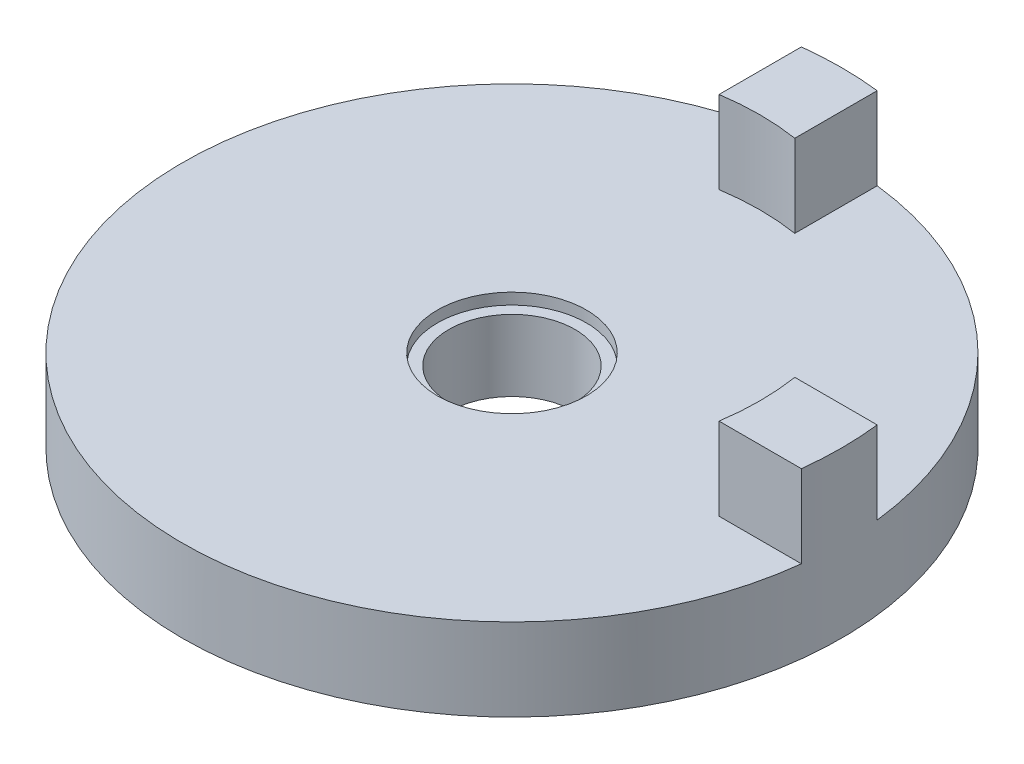
ISO-10303-21;
HEADER;
FILE_DESCRIPTION(('STEP AP214'),'2;1');
FILE_NAME('part.step','',(''),(''),'','','');
FILE_SCHEMA(('AUTOMOTIVE_DESIGN { 1 0 10303 214 1 1 1 1 }'));
ENDSEC;
DATA;
#1=APPLICATION_CONTEXT('core data for automotive mechanical design processes');
#2=APPLICATION_PROTOCOL_DEFINITION('international standard','automotive_design',2000,#1);
#3=PRODUCT_CONTEXT('',#1,'mechanical');
#4=PRODUCT('Part','Part','',(#3));
#5=PRODUCT_RELATED_PRODUCT_CATEGORY('part','',(#4));
#6=PRODUCT_DEFINITION_FORMATION('','',#4);
#7=PRODUCT_DEFINITION_CONTEXT('part definition',#1,'design');
#8=PRODUCT_DEFINITION('design','',#6,#7);
#9=PRODUCT_DEFINITION_SHAPE('','',#8);
#10=(LENGTH_UNIT() NAMED_UNIT(*) SI_UNIT(.MILLI.,.METRE.));
#11=(NAMED_UNIT(*) PLANE_ANGLE_UNIT() SI_UNIT($,.RADIAN.));
#12=(NAMED_UNIT(*) SI_UNIT($,.STERADIAN.) SOLID_ANGLE_UNIT());
#13=UNCERTAINTY_MEASURE_WITH_UNIT(LENGTH_MEASURE(1.E-05),#10,'distance_accuracy_value','');
#14=(GEOMETRIC_REPRESENTATION_CONTEXT(3) GLOBAL_UNCERTAINTY_ASSIGNED_CONTEXT((#13)) GLOBAL_UNIT_ASSIGNED_CONTEXT((#10,
#11,#12)) REPRESENTATION_CONTEXT('',''));
#15=CARTESIAN_POINT('',(0.,0.,0.));
#16=DIRECTION('',(0.,0.,1.));
#17=DIRECTION('',(1.,0.,0.));
#18=AXIS2_PLACEMENT_3D('',#15,#16,#17);
#19=CARTESIAN_POINT('',(0.,6.35,0.));
#20=DIRECTION('',(0.,1.,0.));
#21=DIRECTION('',(0.,0.,1.));
#22=AXIS2_PLACEMENT_3D('',#19,#20,#21);
#23=PLANE('',#22);
#24=CARTESIAN_POINT('',(0.,6.35,0.));
#25=DIRECTION('',(0.,1.,0.));
#26=DIRECTION('',(0.,0.,1.));
#27=AXIS2_PLACEMENT_3D('',#24,#25,#26);
#28=CIRCLE('',#27,5.7404);
#29=CARTESIAN_POINT('',(0.,6.35,5.7404));
#30=VERTEX_POINT('',#29);
#31=EDGE_CURVE('E241',#30,#30,#28,.T.);
#32=ORIENTED_EDGE('',*,*,#31,.F.);
#33=EDGE_LOOP('',(#32));
#34=FACE_BOUND('',#33,.T.);
#35=CARTESIAN_POINT('',(0.,6.35,0.));
#36=DIRECTION('',(0.,1.,0.));
#37=DIRECTION('',(0.,0.,1.));
#38=AXIS2_PLACEMENT_3D('',#35,#36,#37);
#39=CIRCLE('',#38,25.4);
#40=CARTESIAN_POINT('',(-2.921,6.35,-25.2314834878966));
#41=VERTEX_POINT('',#40);
#42=CARTESIAN_POINT('',(25.2314834878965,6.35,2.92100000000086));
#43=VERTEX_POINT('',#42);
#44=EDGE_CURVE('E11',#41,#43,#39,.T.);
#45=ORIENTED_EDGE('',*,*,#44,.T.);
#46=DIRECTION('',(1.,0.,0.));
#47=VECTOR('',#46,1.);
#48=CARTESIAN_POINT('',(0.,6.35,2.921));
#49=LINE('',#48,#47);
#50=CARTESIAN_POINT('',(18.8814834878965,6.35,2.92100000000064));
#51=VERTEX_POINT('',#50);
#52=EDGE_CURVE('E51',#51,#43,#49,.T.);
#53=ORIENTED_EDGE('',*,*,#52,.F.);
#54=CARTESIAN_POINT('',(0.,6.35,0.));
#55=DIRECTION('',(0.,1.,0.));
#56=DIRECTION('',(0.,0.,1.));
#57=AXIS2_PLACEMENT_3D('',#54,#55,#56);
#58=CIRCLE('',#57,19.1060895973957);
#59=CARTESIAN_POINT('',(18.8814834878967,6.35,-2.92099999999936));
#60=VERTEX_POINT('',#59);
#61=EDGE_CURVE('E56',#51,#60,#58,.T.);
#62=ORIENTED_EDGE('',*,*,#61,.T.);
#63=DIRECTION('',(1.,0.,0.));
#64=VECTOR('',#63,1.);
#65=CARTESIAN_POINT('',(0.,6.35,-2.921));
#66=LINE('',#65,#64);
#67=CARTESIAN_POINT('',(25.2314834878967,6.35,-2.92099999999914));
#68=VERTEX_POINT('',#67);
#69=EDGE_CURVE('E121',#60,#68,#66,.T.);
#70=ORIENTED_EDGE('',*,*,#69,.T.);
#71=CARTESIAN_POINT('',(2.921,6.35,-25.2314834878966));
#72=VERTEX_POINT('',#71);
#73=EDGE_CURVE('E39',#68,#72,#39,.T.);
#74=ORIENTED_EDGE('',*,*,#73,.T.);
#75=DIRECTION('',(0.,0.,-1.));
#76=VECTOR('',#75,1.);
#77=CARTESIAN_POINT('',(2.921,6.35,0.));
#78=LINE('',#77,#76);
#79=CARTESIAN_POINT('',(2.921,6.35,-18.8814834878966));
#80=VERTEX_POINT('',#79);
#81=EDGE_CURVE('E148',#80,#72,#78,.T.);
#82=ORIENTED_EDGE('',*,*,#81,.F.);
#83=CARTESIAN_POINT('',(0.,6.35,0.));
#84=DIRECTION('',(0.,1.,0.));
#85=DIRECTION('',(0.,0.,1.));
#86=AXIS2_PLACEMENT_3D('',#83,#84,#85);
#87=CIRCLE('',#86,19.1060895973957);
#88=CARTESIAN_POINT('',(-2.921,6.35,-18.8814834878966));
#89=VERTEX_POINT('',#88);
#90=EDGE_CURVE('E107',#80,#89,#87,.T.);
#91=ORIENTED_EDGE('',*,*,#90,.T.);
#92=DIRECTION('',(0.,0.,-1.));
#93=VECTOR('',#92,1.);
#94=CARTESIAN_POINT('',(-2.921,6.35,0.));
#95=LINE('',#94,#93);
#96=EDGE_CURVE('E139',#89,#41,#95,.T.);
#97=ORIENTED_EDGE('',*,*,#96,.T.);
#98=EDGE_LOOP('',(#45,#53,#62,#70,#74,#82,#91,#97));
#99=FACE_BOUND('',#98,.T.);
#100=ADVANCED_FACE('F35',(#34,#99),#23,.T.);
#101=CARTESIAN_POINT('',(0.,0.,0.));
#102=DIRECTION('',(0.,1.,0.));
#103=DIRECTION('',(0.,0.,1.));
#104=AXIS2_PLACEMENT_3D('',#101,#102,#103);
#105=CYLINDRICAL_SURFACE('',#104,4.8641);
#106=CARTESIAN_POINT('',(0.,0.,0.));
#107=DIRECTION('',(0.,1.,0.));
#108=DIRECTION('',(0.,0.,1.));
#109=AXIS2_PLACEMENT_3D('',#106,#107,#108);
#110=CIRCLE('',#109,4.8641);
#111=CARTESIAN_POINT('',(0.,0.,4.8641));
#112=VERTEX_POINT('',#111);
#113=EDGE_CURVE('E226',#112,#112,#110,.T.);
#114=ORIENTED_EDGE('',*,*,#113,.F.);
#115=EDGE_LOOP('',(#114));
#116=FACE_BOUND('',#115,.T.);
#117=CARTESIAN_POINT('',(0.,5.4864,0.));
#118=DIRECTION('',(0.,1.,0.));
#119=DIRECTION('',(0.,0.,1.));
#120=AXIS2_PLACEMENT_3D('',#117,#118,#119);
#121=CIRCLE('',#120,4.8641);
#122=CARTESIAN_POINT('',(0.,5.4864,4.8641));
#123=VERTEX_POINT('',#122);
#124=EDGE_CURVE('E230',#123,#123,#121,.F.);
#125=ORIENTED_EDGE('',*,*,#124,.F.);
#126=EDGE_LOOP('',(#125));
#127=FACE_BOUND('',#126,.T.);
#128=ADVANCED_FACE('F202',(#116,#127),#105,.F.);
#129=CARTESIAN_POINT('',(0.,6.35,0.));
#130=DIRECTION('',(0.,-1.,0.));
#131=DIRECTION('',(0.,0.,-1.));
#132=AXIS2_PLACEMENT_3D('',#129,#130,#131);
#133=CYLINDRICAL_SURFACE('',#132,25.4);
#134=ORIENTED_EDGE('',*,*,#44,.F.);
#135=DIRECTION('',(0.,-1.,0.));
#136=VECTOR('',#135,1.);
#137=CARTESIAN_POINT('',(-2.921,12.7,-25.2314834878966));
#138=LINE('',#137,#136);
#139=CARTESIAN_POINT('',(-2.921,12.7,-25.2314834878966));
#140=VERTEX_POINT('',#139);
#141=EDGE_CURVE('E159',#140,#41,#138,.T.);
#142=ORIENTED_EDGE('',*,*,#141,.F.);
#143=CARTESIAN_POINT('',(0.,12.7,0.));
#144=DIRECTION('',(0.,1.,0.));
#145=DIRECTION('',(0.,0.,1.));
#146=AXIS2_PLACEMENT_3D('',#143,#144,#145);
#147=CIRCLE('',#146,25.4);
#148=CARTESIAN_POINT('',(2.921,12.7,-25.2314834878966));
#149=VERTEX_POINT('',#148);
#150=EDGE_CURVE('E141',#149,#140,#147,.T.);
#151=ORIENTED_EDGE('',*,*,#150,.F.);
#152=DIRECTION('',(0.,-1.,0.));
#153=VECTOR('',#152,1.);
#154=CARTESIAN_POINT('',(2.921,12.7,-25.2314834878966));
#155=LINE('',#154,#153);
#156=EDGE_CURVE('E155',#149,#72,#155,.T.);
#157=ORIENTED_EDGE('',*,*,#156,.T.);
#158=ORIENTED_EDGE('',*,*,#73,.F.);
#159=DIRECTION('',(0.,-1.,0.));
#160=VECTOR('',#159,1.);
#161=CARTESIAN_POINT('',(25.2314834878967,12.7,-2.92099999999914));
#162=LINE('',#161,#160);
#163=CARTESIAN_POINT('',(25.2314834878967,12.7,-2.92099999999914));
#164=VERTEX_POINT('',#163);
#165=EDGE_CURVE('E131',#164,#68,#162,.T.);
#166=ORIENTED_EDGE('',*,*,#165,.F.);
#167=CARTESIAN_POINT('',(0.,12.7,0.));
#168=DIRECTION('',(0.,1.,0.));
#169=DIRECTION('',(0.,0.,1.));
#170=AXIS2_PLACEMENT_3D('',#167,#168,#169);
#171=CIRCLE('',#170,25.4);
#172=CARTESIAN_POINT('',(25.2314834878965,12.7,2.92100000000086));
#173=VERTEX_POINT('',#172);
#174=EDGE_CURVE('E116',#173,#164,#171,.T.);
#175=ORIENTED_EDGE('',*,*,#174,.F.);
#176=DIRECTION('',(0.,-1.,0.));
#177=VECTOR('',#176,1.);
#178=CARTESIAN_POINT('',(25.2314834878965,12.7,2.92100000000086));
#179=LINE('',#178,#177);
#180=EDGE_CURVE('E108',#173,#43,#179,.T.);
#181=ORIENTED_EDGE('',*,*,#180,.T.);
#182=EDGE_LOOP('',(#134,#142,#151,#157,#158,#166,#175,#181));
#183=FACE_BOUND('',#182,.T.);
#184=CARTESIAN_POINT('',(0.,0.,0.));
#185=DIRECTION('',(0.,1.,0.));
#186=DIRECTION('',(0.,0.,1.));
#187=AXIS2_PLACEMENT_3D('',#184,#185,#186);
#188=CIRCLE('',#187,25.4);
#189=CARTESIAN_POINT('',(0.,0.,25.4));
#190=VERTEX_POINT('',#189);
#191=EDGE_CURVE('E186',#190,#190,#188,.T.);
#192=ORIENTED_EDGE('',*,*,#191,.T.);
#193=EDGE_LOOP('',(#192));
#194=FACE_BOUND('',#193,.T.);
#195=ADVANCED_FACE('F37',(#183,#194),#133,.T.);
#196=CARTESIAN_POINT('',(0.,0.,0.));
#197=DIRECTION('',(0.,1.,0.));
#198=DIRECTION('',(0.,0.,1.));
#199=AXIS2_PLACEMENT_3D('',#196,#197,#198);
#200=PLANE('',#199);
#201=ORIENTED_EDGE('',*,*,#113,.T.);
#202=EDGE_LOOP('',(#201));
#203=FACE_BOUND('',#202,.T.);
#204=ORIENTED_EDGE('',*,*,#191,.F.);
#205=EDGE_LOOP('',(#204));
#206=FACE_BOUND('',#205,.T.);
#207=ADVANCED_FACE('F212',(#203,#206),#200,.F.);
#208=CARTESIAN_POINT('',(0.,5.4864,0.));
#209=DIRECTION('',(0.,1.,0.));
#210=DIRECTION('',(0.,0.,1.));
#211=AXIS2_PLACEMENT_3D('',#208,#209,#210);
#212=PLANE('',#211);
#213=CARTESIAN_POINT('',(0.,5.4864,0.));
#214=DIRECTION('',(0.,1.,0.));
#215=DIRECTION('',(0.,0.,1.));
#216=AXIS2_PLACEMENT_3D('',#213,#214,#215);
#217=CIRCLE('',#216,5.7404);
#218=CARTESIAN_POINT('',(0.,5.4864,5.7404));
#219=VERTEX_POINT('',#218);
#220=EDGE_CURVE('E235',#219,#219,#217,.T.);
#221=ORIENTED_EDGE('',*,*,#220,.T.);
#222=EDGE_LOOP('',(#221));
#223=FACE_BOUND('',#222,.T.);
#224=ORIENTED_EDGE('',*,*,#124,.T.);
#225=EDGE_LOOP('',(#224));
#226=FACE_BOUND('',#225,.T.);
#227=ADVANCED_FACE('F214',(#223,#226),#212,.T.);
#228=CARTESIAN_POINT('',(0.,5.4864,0.));
#229=DIRECTION('',(0.,1.,0.));
#230=DIRECTION('',(0.,0.,1.));
#231=AXIS2_PLACEMENT_3D('',#228,#229,#230);
#232=CYLINDRICAL_SURFACE('',#231,5.7404);
#233=ORIENTED_EDGE('',*,*,#220,.F.);
#234=EDGE_LOOP('',(#233));
#235=FACE_BOUND('',#234,.T.);
#236=ORIENTED_EDGE('',*,*,#31,.T.);
#237=EDGE_LOOP('',(#236));
#238=FACE_BOUND('',#237,.T.);
#239=ADVANCED_FACE('F220',(#235,#238),#232,.F.);
#240=CARTESIAN_POINT('',(0.,12.7,0.));
#241=DIRECTION('',(0.,-1.,0.));
#242=DIRECTION('',(0.,0.,-1.));
#243=AXIS2_PLACEMENT_3D('',#240,#241,#242);
#244=CYLINDRICAL_SURFACE('',#243,19.1060895973957);
#245=ORIENTED_EDGE('',*,*,#90,.F.);
#246=DIRECTION('',(0.,-1.,0.));
#247=VECTOR('',#246,1.);
#248=CARTESIAN_POINT('',(2.921,12.7,-18.8814834878966));
#249=LINE('',#248,#247);
#250=CARTESIAN_POINT('',(2.921,12.7,-18.8814834878966));
#251=VERTEX_POINT('',#250);
#252=EDGE_CURVE('E158',#251,#80,#249,.T.);
#253=ORIENTED_EDGE('',*,*,#252,.F.);
#254=CARTESIAN_POINT('',(0.,12.7,0.));
#255=DIRECTION('',(0.,1.,0.));
#256=DIRECTION('',(0.,0.,1.));
#257=AXIS2_PLACEMENT_3D('',#254,#255,#256);
#258=CIRCLE('',#257,19.1060895973957);
#259=CARTESIAN_POINT('',(-2.921,12.7,-18.8814834878966));
#260=VERTEX_POINT('',#259);
#261=EDGE_CURVE('E135',#251,#260,#258,.T.);
#262=ORIENTED_EDGE('',*,*,#261,.T.);
#263=DIRECTION('',(0.,-1.,0.));
#264=VECTOR('',#263,1.);
#265=CARTESIAN_POINT('',(-2.921,12.7,-18.8814834878966));
#266=LINE('',#265,#264);
#267=EDGE_CURVE('E146',#260,#89,#266,.T.);
#268=ORIENTED_EDGE('',*,*,#267,.T.);
#269=EDGE_LOOP('',(#245,#253,#262,#268));
#270=FACE_BOUND('',#269,.T.);
#271=ADVANCED_FACE('F173',(#270),#244,.F.);
#272=CARTESIAN_POINT('',(2.921,12.7,0.));
#273=DIRECTION('',(-1.,0.,0.));
#274=DIRECTION('',(0.,0.,1.));
#275=AXIS2_PLACEMENT_3D('',#272,#273,#274);
#276=PLANE('',#275);
#277=ORIENTED_EDGE('',*,*,#81,.T.);
#278=ORIENTED_EDGE('',*,*,#156,.F.);
#279=DIRECTION('',(0.,0.,-1.));
#280=VECTOR('',#279,1.);
#281=CARTESIAN_POINT('',(2.921,12.7,0.));
#282=LINE('',#281,#280);
#283=EDGE_CURVE('E138',#251,#149,#282,.T.);
#284=ORIENTED_EDGE('',*,*,#283,.F.);
#285=ORIENTED_EDGE('',*,*,#252,.T.);
#286=EDGE_LOOP('',(#277,#278,#284,#285));
#287=FACE_BOUND('',#286,.T.);
#288=ADVANCED_FACE('F189',(#287),#276,.F.);
#289=CARTESIAN_POINT('',(-2.921,12.7,0.));
#290=DIRECTION('',(-1.,0.,0.));
#291=DIRECTION('',(0.,0.,1.));
#292=AXIS2_PLACEMENT_3D('',#289,#290,#291);
#293=PLANE('',#292);
#294=ORIENTED_EDGE('',*,*,#96,.F.);
#295=ORIENTED_EDGE('',*,*,#267,.F.);
#296=DIRECTION('',(0.,0.,-1.));
#297=VECTOR('',#296,1.);
#298=CARTESIAN_POINT('',(-2.921,12.7,0.));
#299=LINE('',#298,#297);
#300=EDGE_CURVE('E143',#260,#140,#299,.T.);
#301=ORIENTED_EDGE('',*,*,#300,.T.);
#302=ORIENTED_EDGE('',*,*,#141,.T.);
#303=EDGE_LOOP('',(#294,#295,#301,#302));
#304=FACE_BOUND('',#303,.T.);
#305=ADVANCED_FACE('F176',(#304),#293,.T.);
#306=CARTESIAN_POINT('',(0.,12.7,0.));
#307=DIRECTION('',(0.,1.,0.));
#308=DIRECTION('',(0.,0.,1.));
#309=AXIS2_PLACEMENT_3D('',#306,#307,#308);
#310=PLANE('',#309);
#311=ORIENTED_EDGE('',*,*,#261,.F.);
#312=ORIENTED_EDGE('',*,*,#283,.T.);
#313=ORIENTED_EDGE('',*,*,#150,.T.);
#314=ORIENTED_EDGE('',*,*,#300,.F.);
#315=EDGE_LOOP('',(#311,#312,#313,#314));
#316=FACE_BOUND('',#315,.T.);
#317=ADVANCED_FACE('F192',(#316),#310,.T.);
#318=CARTESIAN_POINT('',(0.,12.7,0.));
#319=DIRECTION('',(0.,-1.,0.));
#320=DIRECTION('',(0.,0.,-1.));
#321=AXIS2_PLACEMENT_3D('',#318,#319,#320);
#322=CYLINDRICAL_SURFACE('',#321,19.1060895973957);
#323=ORIENTED_EDGE('',*,*,#61,.F.);
#324=DIRECTION('',(0.,-1.,0.));
#325=VECTOR('',#324,1.);
#326=CARTESIAN_POINT('',(18.8814834878965,12.7,2.92100000000064));
#327=LINE('',#326,#325);
#328=CARTESIAN_POINT('',(18.8814834878965,12.7,2.92100000000064));
#329=VERTEX_POINT('',#328);
#330=EDGE_CURVE('E100',#329,#51,#327,.T.);
#331=ORIENTED_EDGE('',*,*,#330,.F.);
#332=CARTESIAN_POINT('',(0.,12.7,0.));
#333=DIRECTION('',(0.,1.,0.));
#334=DIRECTION('',(0.,0.,1.));
#335=AXIS2_PLACEMENT_3D('',#332,#333,#334);
#336=CIRCLE('',#335,19.1060895973957);
#337=CARTESIAN_POINT('',(18.8814834878967,12.7,-2.92099999999936));
#338=VERTEX_POINT('',#337);
#339=EDGE_CURVE('E104',#329,#338,#336,.T.);
#340=ORIENTED_EDGE('',*,*,#339,.T.);
#341=DIRECTION('',(0.,-1.,0.));
#342=VECTOR('',#341,1.);
#343=CARTESIAN_POINT('',(18.8814834878967,12.7,-2.92099999999936));
#344=LINE('',#343,#342);
#345=EDGE_CURVE('E127',#338,#60,#344,.T.);
#346=ORIENTED_EDGE('',*,*,#345,.T.);
#347=EDGE_LOOP('',(#323,#331,#340,#346));
#348=FACE_BOUND('',#347,.T.);
#349=ADVANCED_FACE('F102',(#348),#322,.F.);
#350=CARTESIAN_POINT('',(0.,12.7,2.921));
#351=DIRECTION('',(0.,0.,-1.));
#352=DIRECTION('',(-1.,0.,0.));
#353=AXIS2_PLACEMENT_3D('',#350,#351,#352);
#354=PLANE('',#353);
#355=ORIENTED_EDGE('',*,*,#52,.T.);
#356=ORIENTED_EDGE('',*,*,#180,.F.);
#357=DIRECTION('',(1.,0.,0.));
#358=VECTOR('',#357,1.);
#359=CARTESIAN_POINT('',(0.,12.7,2.921));
#360=LINE('',#359,#358);
#361=EDGE_CURVE('E111',#329,#173,#360,.T.);
#362=ORIENTED_EDGE('',*,*,#361,.F.);
#363=ORIENTED_EDGE('',*,*,#330,.T.);
#364=EDGE_LOOP('',(#355,#356,#362,#363));
#365=FACE_BOUND('',#364,.T.);
#366=ADVANCED_FACE('F112',(#365),#354,.F.);
#367=CARTESIAN_POINT('',(0.,12.7,-2.921));
#368=DIRECTION('',(0.,0.,-1.));
#369=DIRECTION('',(-1.,0.,0.));
#370=AXIS2_PLACEMENT_3D('',#367,#368,#369);
#371=PLANE('',#370);
#372=ORIENTED_EDGE('',*,*,#69,.F.);
#373=ORIENTED_EDGE('',*,*,#345,.F.);
#374=DIRECTION('',(1.,0.,0.));
#375=VECTOR('',#374,1.);
#376=CARTESIAN_POINT('',(0.,12.7,-2.921));
#377=LINE('',#376,#375);
#378=EDGE_CURVE('E120',#338,#164,#377,.T.);
#379=ORIENTED_EDGE('',*,*,#378,.T.);
#380=ORIENTED_EDGE('',*,*,#165,.T.);
#381=EDGE_LOOP('',(#372,#373,#379,#380));
#382=FACE_BOUND('',#381,.T.);
#383=ADVANCED_FACE('F184',(#382),#371,.T.);
#384=CARTESIAN_POINT('',(0.,12.7,0.));
#385=DIRECTION('',(0.,1.,0.));
#386=DIRECTION('',(0.,0.,1.));
#387=AXIS2_PLACEMENT_3D('',#384,#385,#386);
#388=PLANE('',#387);
#389=ORIENTED_EDGE('',*,*,#339,.F.);
#390=ORIENTED_EDGE('',*,*,#361,.T.);
#391=ORIENTED_EDGE('',*,*,#174,.T.);
#392=ORIENTED_EDGE('',*,*,#378,.F.);
#393=EDGE_LOOP('',(#389,#390,#391,#392));
#394=FACE_BOUND('',#393,.T.);
#395=ADVANCED_FACE('F118',(#394),#388,.T.);
#396=CLOSED_SHELL('',(#100,#128,#195,#207,#227,#239,#271,#288,#305,#317,#349,#366,#383,#395));
#397=MANIFOLD_SOLID_BREP('B2',#396);
#398=ADVANCED_BREP_SHAPE_REPRESENTATION('',(#18,#397),#14);
#399=SHAPE_DEFINITION_REPRESENTATION(#9,#398);
ENDSEC;
END-ISO-10303-21;
